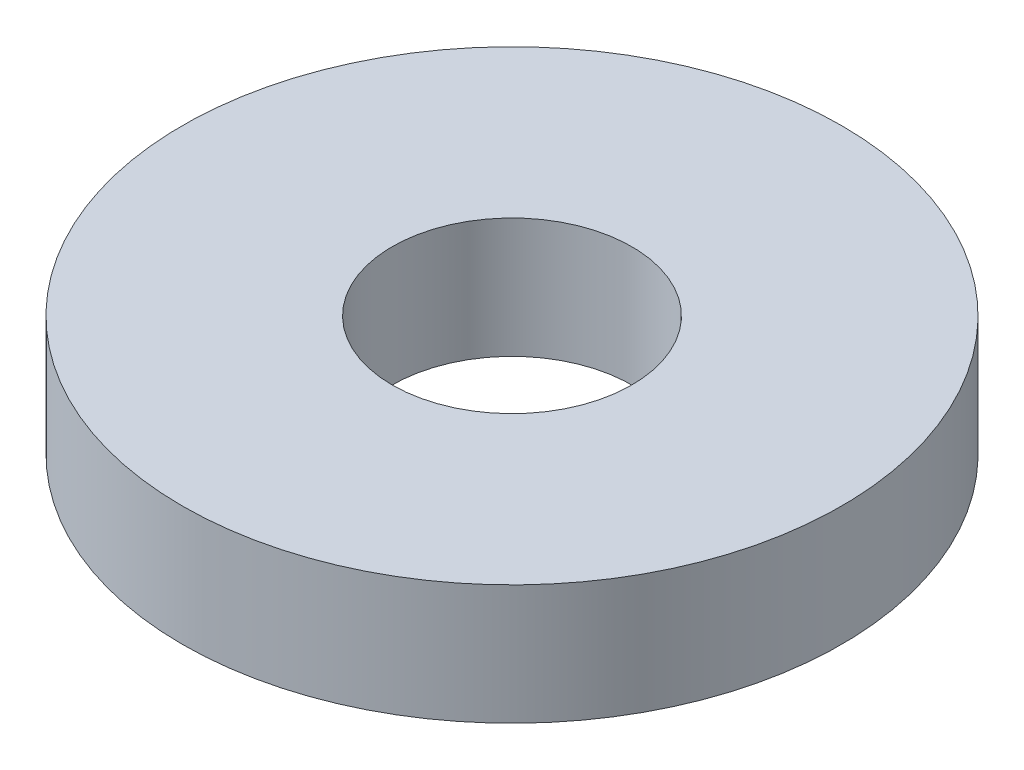
ISO-10303-21;
HEADER;
FILE_DESCRIPTION(('STEP AP214'),'2;1');
FILE_NAME('part.step','',(''),(''),'','','');
FILE_SCHEMA(('AUTOMOTIVE_DESIGN { 1 0 10303 214 1 1 1 1 }'));
ENDSEC;
DATA;
#1=APPLICATION_CONTEXT('core data for automotive mechanical design processes');
#2=APPLICATION_PROTOCOL_DEFINITION('international standard','automotive_design',2000,#1);
#3=PRODUCT_CONTEXT('',#1,'mechanical');
#4=PRODUCT('Part','Part','',(#3));
#5=PRODUCT_RELATED_PRODUCT_CATEGORY('part','',(#4));
#6=PRODUCT_DEFINITION_FORMATION('','',#4);
#7=PRODUCT_DEFINITION_CONTEXT('part definition',#1,'design');
#8=PRODUCT_DEFINITION('design','',#6,#7);
#9=PRODUCT_DEFINITION_SHAPE('','',#8);
#10=(LENGTH_UNIT() NAMED_UNIT(*) SI_UNIT(.MILLI.,.METRE.));
#11=(NAMED_UNIT(*) PLANE_ANGLE_UNIT() SI_UNIT($,.RADIAN.));
#12=(NAMED_UNIT(*) SI_UNIT($,.STERADIAN.) SOLID_ANGLE_UNIT());
#13=UNCERTAINTY_MEASURE_WITH_UNIT(LENGTH_MEASURE(1.E-05),#10,'distance_accuracy_value','');
#14=(GEOMETRIC_REPRESENTATION_CONTEXT(3) GLOBAL_UNCERTAINTY_ASSIGNED_CONTEXT((#13)) GLOBAL_UNIT_ASSIGNED_CONTEXT((#10,
#11,#12)) REPRESENTATION_CONTEXT('',''));
#15=CARTESIAN_POINT('',(0.,0.,0.));
#16=DIRECTION('',(0.,0.,1.));
#17=DIRECTION('',(1.,0.,0.));
#18=AXIS2_PLACEMENT_3D('',#15,#16,#17);
#19=CARTESIAN_POINT('',(0.,4.,0.));
#20=DIRECTION('',(0.,1.,0.));
#21=DIRECTION('',(0.,0.,1.));
#22=AXIS2_PLACEMENT_3D('',#19,#20,#21);
#23=PLANE('',#22);
#24=CARTESIAN_POINT('',(0.,4.,0.));
#25=DIRECTION('',(0.,1.,0.));
#26=DIRECTION('',(0.,0.,1.));
#27=AXIS2_PLACEMENT_3D('',#24,#25,#26);
#28=CIRCLE('',#27,11.);
#29=CARTESIAN_POINT('',(0.,4.,11.));
#30=VERTEX_POINT('',#29);
#31=EDGE_CURVE('E10',#30,#30,#28,.T.);
#32=ORIENTED_EDGE('',*,*,#31,.T.);
#33=EDGE_LOOP('',(#32));
#34=FACE_BOUND('',#33,.T.);
#35=CARTESIAN_POINT('',(0.,4.,0.));
#36=DIRECTION('',(0.,1.,0.));
#37=DIRECTION('',(0.,0.,1.));
#38=AXIS2_PLACEMENT_3D('',#35,#36,#37);
#39=CIRCLE('',#38,4.);
#40=CARTESIAN_POINT('',(0.,4.,4.));
#41=VERTEX_POINT('',#40);
#42=EDGE_CURVE('E39',#41,#41,#39,.T.);
#43=ORIENTED_EDGE('',*,*,#42,.F.);
#44=EDGE_LOOP('',(#43));
#45=FACE_BOUND('',#44,.T.);
#46=ADVANCED_FACE('F28',(#34,#45),#23,.T.);
#47=CARTESIAN_POINT('',(0.,0.,0.));
#48=DIRECTION('',(0.,1.,0.));
#49=DIRECTION('',(0.,0.,1.));
#50=AXIS2_PLACEMENT_3D('',#47,#48,#49);
#51=PLANE('',#50);
#52=CARTESIAN_POINT('',(0.,0.,0.));
#53=DIRECTION('',(0.,1.,0.));
#54=DIRECTION('',(0.,0.,1.));
#55=AXIS2_PLACEMENT_3D('',#52,#53,#54);
#56=CIRCLE('',#55,11.);
#57=CARTESIAN_POINT('',(0.,0.,11.));
#58=VERTEX_POINT('',#57);
#59=EDGE_CURVE('E32',#58,#58,#56,.T.);
#60=ORIENTED_EDGE('',*,*,#59,.F.);
#61=EDGE_LOOP('',(#60));
#62=FACE_BOUND('',#61,.T.);
#63=CARTESIAN_POINT('',(0.,0.,0.));
#64=DIRECTION('',(0.,1.,0.));
#65=DIRECTION('',(0.,0.,1.));
#66=AXIS2_PLACEMENT_3D('',#63,#64,#65);
#67=CIRCLE('',#66,4.);
#68=CARTESIAN_POINT('',(0.,0.,4.));
#69=VERTEX_POINT('',#68);
#70=EDGE_CURVE('E41',#69,#69,#67,.T.);
#71=ORIENTED_EDGE('',*,*,#70,.T.);
#72=EDGE_LOOP('',(#71));
#73=FACE_BOUND('',#72,.T.);
#74=ADVANCED_FACE('F51',(#62,#73),#51,.F.);
#75=CARTESIAN_POINT('',(0.,4.,0.));
#76=DIRECTION('',(0.,-1.,0.));
#77=DIRECTION('',(0.,0.,-1.));
#78=AXIS2_PLACEMENT_3D('',#75,#76,#77);
#79=CYLINDRICAL_SURFACE('',#78,11.);
#80=ORIENTED_EDGE('',*,*,#31,.F.);
#81=EDGE_LOOP('',(#80));
#82=FACE_BOUND('',#81,.T.);
#83=ORIENTED_EDGE('',*,*,#59,.T.);
#84=EDGE_LOOP('',(#83));
#85=FACE_BOUND('',#84,.T.);
#86=ADVANCED_FACE('F30',(#82,#85),#79,.T.);
#87=CARTESIAN_POINT('',(0.,4.,0.));
#88=DIRECTION('',(0.,-1.,0.));
#89=DIRECTION('',(0.,0.,-1.));
#90=AXIS2_PLACEMENT_3D('',#87,#88,#89);
#91=CYLINDRICAL_SURFACE('',#90,4.);
#92=ORIENTED_EDGE('',*,*,#42,.T.);
#93=EDGE_LOOP('',(#92));
#94=FACE_BOUND('',#93,.T.);
#95=ORIENTED_EDGE('',*,*,#70,.F.);
#96=EDGE_LOOP('',(#95));
#97=FACE_BOUND('',#96,.T.);
#98=ADVANCED_FACE('F47',(#94,#97),#91,.F.);
#99=CLOSED_SHELL('',(#46,#74,#86,#98));
#100=MANIFOLD_SOLID_BREP('B2',#99);
#101=ADVANCED_BREP_SHAPE_REPRESENTATION('',(#18,#100),#14);
#102=SHAPE_DEFINITION_REPRESENTATION(#9,#101);
ENDSEC;
END-ISO-10303-21;
